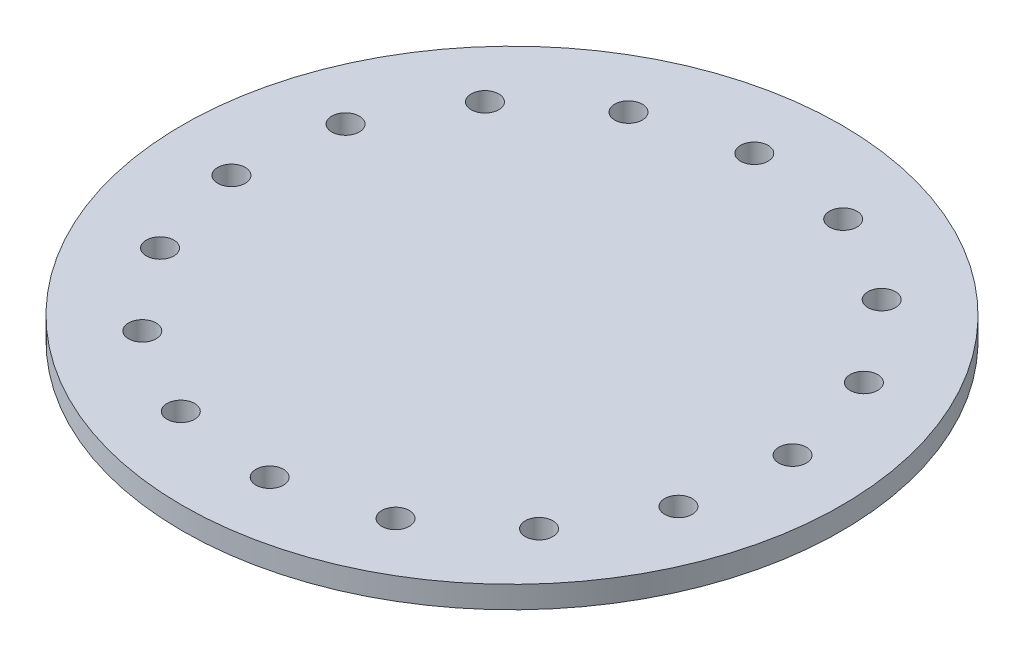
ISO-10303-21;
HEADER;
FILE_DESCRIPTION(('STEP AP214'),'2;1');
FILE_NAME('part.step','',(''),(''),'','','');
FILE_SCHEMA(('AUTOMOTIVE_DESIGN { 1 0 10303 214 1 1 1 1 }'));
ENDSEC;
DATA;
#1=APPLICATION_CONTEXT('core data for automotive mechanical design processes');
#2=APPLICATION_PROTOCOL_DEFINITION('international standard','automotive_design',2000,#1);
#3=PRODUCT_CONTEXT('',#1,'mechanical');
#4=PRODUCT('Part','Part','',(#3));
#5=PRODUCT_RELATED_PRODUCT_CATEGORY('part','',(#4));
#6=PRODUCT_DEFINITION_FORMATION('','',#4);
#7=PRODUCT_DEFINITION_CONTEXT('part definition',#1,'design');
#8=PRODUCT_DEFINITION('design','',#6,#7);
#9=PRODUCT_DEFINITION_SHAPE('','',#8);
#10=(LENGTH_UNIT() NAMED_UNIT(*) SI_UNIT(.MILLI.,.METRE.));
#11=(NAMED_UNIT(*) PLANE_ANGLE_UNIT() SI_UNIT($,.RADIAN.));
#12=(NAMED_UNIT(*) SI_UNIT($,.STERADIAN.) SOLID_ANGLE_UNIT());
#13=UNCERTAINTY_MEASURE_WITH_UNIT(LENGTH_MEASURE(1.E-05),#10,'distance_accuracy_value','');
#14=(GEOMETRIC_REPRESENTATION_CONTEXT(3) GLOBAL_UNCERTAINTY_ASSIGNED_CONTEXT((#13)) GLOBAL_UNIT_ASSIGNED_CONTEXT((#10,
#11,#12)) REPRESENTATION_CONTEXT('',''));
#15=CARTESIAN_POINT('',(0.,0.,0.));
#16=DIRECTION('',(0.,0.,1.));
#17=DIRECTION('',(1.,0.,0.));
#18=AXIS2_PLACEMENT_3D('',#15,#16,#17);
#19=CARTESIAN_POINT('',(0.,1.,0.));
#20=DIRECTION('',(0.,-1.,0.));
#21=DIRECTION('',(0.,0.,-1.));
#22=AXIS2_PLACEMENT_3D('',#19,#20,#21);
#23=CYLINDRICAL_SURFACE('',#22,29.86111111);
#24=CARTESIAN_POINT('',(0.,1.,0.));
#25=DIRECTION('',(0.,1.,0.));
#26=DIRECTION('',(0.,0.,1.));
#27=AXIS2_PLACEMENT_3D('',#24,#25,#26);
#28=CIRCLE('',#27,29.86111111);
#29=CARTESIAN_POINT('',(0.,1.,29.86111111));
#30=VERTEX_POINT('',#29);
#31=EDGE_CURVE('E10',#30,#30,#28,.T.);
#32=ORIENTED_EDGE('',*,*,#31,.F.);
#33=EDGE_LOOP('',(#32));
#34=FACE_BOUND('',#33,.T.);
#35=CARTESIAN_POINT('',(0.,-1.,0.));
#36=DIRECTION('',(0.,1.,0.));
#37=DIRECTION('',(0.,0.,1.));
#38=AXIS2_PLACEMENT_3D('',#35,#36,#37);
#39=CIRCLE('',#38,29.86111111);
#40=CARTESIAN_POINT('',(0.,-1.,29.86111111));
#41=VERTEX_POINT('',#40);
#42=EDGE_CURVE('E40',#41,#41,#39,.T.);
#43=ORIENTED_EDGE('',*,*,#42,.T.);
#44=EDGE_LOOP('',(#43));
#45=FACE_BOUND('',#44,.T.);
#46=ADVANCED_FACE('F37',(#34,#45),#23,.T.);
#47=CARTESIAN_POINT('',(0.,1.,0.));
#48=DIRECTION('',(0.,1.,0.));
#49=DIRECTION('',(0.,0.,1.));
#50=AXIS2_PLACEMENT_3D('',#47,#48,#49);
#51=PLANE('',#50);
#52=CARTESIAN_POINT('',(7.46283868033029,1.,-22.5470294901846));
#53=DIRECTION('',(0.,1.,0.));
#54=DIRECTION('',(0.,0.,1.));
#55=AXIS2_PLACEMENT_3D('',#52,#53,#54);
#56=CIRCLE('',#55,1.25);
#57=CARTESIAN_POINT('',(7.46283868033029,1.,-21.2970294901846));
#58=VERTEX_POINT('',#57);
#59=EDGE_CURVE('E47',#58,#58,#56,.T.);
#60=ORIENTED_EDGE('',*,*,#59,.F.);
#61=EDGE_LOOP('',(#60));
#62=FACE_BOUND('',#61,.T.);
#63=CARTESIAN_POINT('',(15.5231385461332,1.,-17.9748343435354));
#64=DIRECTION('',(0.,1.,0.));
#65=DIRECTION('',(0.,0.,1.));
#66=AXIS2_PLACEMENT_3D('',#63,#64,#65);
#67=CIRCLE('',#66,1.25000000000001);
#68=CARTESIAN_POINT('',(15.5231385461332,1.,-16.7248343435354));
#69=VERTEX_POINT('',#68);
#70=EDGE_CURVE('E51',#69,#69,#67,.T.);
#71=ORIENTED_EDGE('',*,*,#70,.F.);
#72=EDGE_LOOP('',(#71));
#73=FACE_BOUND('',#72,.T.);
#74=CARTESIAN_POINT('',(21.2201812858892,1.,-10.6661336103613));
#75=DIRECTION('',(0.,1.,0.));
#76=DIRECTION('',(0.,0.,1.));
#77=AXIS2_PLACEMENT_3D('',#74,#75,#76);
#78=CIRCLE('',#77,1.25);
#79=CARTESIAN_POINT('',(21.2201812858892,1.,-9.41613361036133));
#80=VERTEX_POINT('',#79);
#81=EDGE_CURVE('E54',#80,#80,#78,.T.);
#82=ORIENTED_EDGE('',*,*,#81,.F.);
#83=EDGE_LOOP('',(#82));
#84=FACE_BOUND('',#83,.T.);
#85=CARTESIAN_POINT('',(23.6866437862914,1.,-1.73361072375152));
#86=DIRECTION('',(0.,1.,0.));
#87=DIRECTION('',(0.,0.,1.));
#88=AXIS2_PLACEMENT_3D('',#85,#86,#87);
#89=CIRCLE('',#88,1.25);
#90=CARTESIAN_POINT('',(23.6866437862914,1.,-0.483610723751521));
#91=VERTEX_POINT('',#90);
#92=EDGE_CURVE('E57',#91,#91,#89,.T.);
#93=ORIENTED_EDGE('',*,*,#92,.F.);
#94=EDGE_LOOP('',(#93));
#95=FACE_BOUND('',#94,.T.);
#96=CARTESIAN_POINT('',(22.5470294901922,1.,7.46283868032999));
#97=DIRECTION('',(0.,1.,0.));
#98=DIRECTION('',(0.,0.,1.));
#99=AXIS2_PLACEMENT_3D('',#96,#97,#98);
#100=CIRCLE('',#99,1.25);
#101=CARTESIAN_POINT('',(22.5470294901922,1.,8.71283868032999));
#102=VERTEX_POINT('',#101);
#103=EDGE_CURVE('E60',#102,#102,#100,.T.);
#104=ORIENTED_EDGE('',*,*,#103,.F.);
#105=EDGE_LOOP('',(#104));
#106=FACE_BOUND('',#105,.T.);
#107=CARTESIAN_POINT('',(17.974834343543,1.,15.5231385461329));
#108=DIRECTION('',(0.,1.,0.));
#109=DIRECTION('',(0.,0.,1.));
#110=AXIS2_PLACEMENT_3D('',#107,#108,#109);
#111=CIRCLE('',#110,1.25);
#112=CARTESIAN_POINT('',(17.974834343543,1.,16.7731385461329));
#113=VERTEX_POINT('',#112);
#114=EDGE_CURVE('E63',#113,#113,#111,.T.);
#115=ORIENTED_EDGE('',*,*,#114,.F.);
#116=EDGE_LOOP('',(#115));
#117=FACE_BOUND('',#116,.T.);
#118=CARTESIAN_POINT('',(10.666133610369,1.,21.220181285889));
#119=DIRECTION('',(0.,1.,0.));
#120=DIRECTION('',(0.,0.,1.));
#121=AXIS2_PLACEMENT_3D('',#118,#119,#120);
#122=CIRCLE('',#121,1.25000000000003);
#123=CARTESIAN_POINT('',(10.666133610369,1.,22.470181285889));
#124=VERTEX_POINT('',#123);
#125=EDGE_CURVE('E66',#124,#124,#122,.T.);
#126=ORIENTED_EDGE('',*,*,#125,.F.);
#127=EDGE_LOOP('',(#126));
#128=FACE_BOUND('',#127,.T.);
#129=CARTESIAN_POINT('',(-1.7336107237512,1.,-23.686643786284));
#130=DIRECTION('',(0.,1.,0.));
#131=DIRECTION('',(0.,0.,1.));
#132=AXIS2_PLACEMENT_3D('',#129,#130,#131);
#133=CIRCLE('',#132,1.24999999999999);
#134=CARTESIAN_POINT('',(-1.7336107237512,1.,-22.436643786284));
#135=VERTEX_POINT('',#134);
#136=EDGE_CURVE('E69',#135,#135,#133,.T.);
#137=ORIENTED_EDGE('',*,*,#136,.F.);
#138=EDGE_LOOP('',(#137));
#139=FACE_BOUND('',#138,.T.);
#140=CARTESIAN_POINT('',(-10.6661336103613,1.,-21.2201812858817));
#141=DIRECTION('',(0.,1.,0.));
#142=DIRECTION('',(0.,0.,1.));
#143=AXIS2_PLACEMENT_3D('',#140,#141,#142);
#144=CIRCLE('',#143,1.25000000000003);
#145=CARTESIAN_POINT('',(-10.6661336103613,1.,-19.9701812858817));
#146=VERTEX_POINT('',#145);
#147=EDGE_CURVE('E72',#146,#146,#144,.T.);
#148=ORIENTED_EDGE('',*,*,#147,.F.);
#149=EDGE_LOOP('',(#148));
#150=FACE_BOUND('',#149,.T.);
#151=CARTESIAN_POINT('',(-17.9748343435354,1.,-15.5231385461257));
#152=DIRECTION('',(0.,1.,0.));
#153=DIRECTION('',(0.,0.,1.));
#154=AXIS2_PLACEMENT_3D('',#151,#152,#153);
#155=CIRCLE('',#154,1.24999999999999);
#156=CARTESIAN_POINT('',(-17.9748343435354,1.,-14.2731385461257));
#157=VERTEX_POINT('',#156);
#158=EDGE_CURVE('E75',#157,#157,#155,.T.);
#159=ORIENTED_EDGE('',*,*,#158,.F.);
#160=EDGE_LOOP('',(#159));
#161=FACE_BOUND('',#160,.T.);
#162=CARTESIAN_POINT('',(-22.5470294901846,1.,-7.46283868032276));
#163=DIRECTION('',(0.,1.,0.));
#164=DIRECTION('',(0.,0.,1.));
#165=AXIS2_PLACEMENT_3D('',#162,#163,#164);
#166=CIRCLE('',#165,1.25);
#167=CARTESIAN_POINT('',(-22.5470294901846,1.,-6.21283868032276));
#168=VERTEX_POINT('',#167);
#169=EDGE_CURVE('E78',#168,#168,#166,.T.);
#170=ORIENTED_EDGE('',*,*,#169,.F.);
#171=EDGE_LOOP('',(#170));
#172=FACE_BOUND('',#171,.T.);
#173=CARTESIAN_POINT('',(-23.6866437862839,1.,1.73361072375891));
#174=DIRECTION('',(0.,1.,0.));
#175=DIRECTION('',(0.,0.,1.));
#176=AXIS2_PLACEMENT_3D('',#173,#174,#175);
#177=CIRCLE('',#176,1.25);
#178=CARTESIAN_POINT('',(-23.6866437862839,1.,2.98361072375891));
#179=VERTEX_POINT('',#178);
#180=EDGE_CURVE('E81',#179,#179,#177,.T.);
#181=ORIENTED_EDGE('',*,*,#180,.F.);
#182=EDGE_LOOP('',(#181));
#183=FACE_BOUND('',#182,.T.);
#184=CARTESIAN_POINT('',(-21.2201812858815,1.,10.6661336103689));
#185=DIRECTION('',(0.,1.,0.));
#186=DIRECTION('',(0.,0.,1.));
#187=AXIS2_PLACEMENT_3D('',#184,#185,#186);
#188=CIRCLE('',#187,1.25);
#189=CARTESIAN_POINT('',(-21.2201812858815,1.,11.9161336103689));
#190=VERTEX_POINT('',#189);
#191=EDGE_CURVE('E84',#190,#190,#188,.T.);
#192=ORIENTED_EDGE('',*,*,#191,.F.);
#193=EDGE_LOOP('',(#192));
#194=FACE_BOUND('',#193,.T.);
#195=CARTESIAN_POINT('',(-15.5231385461255,1.,17.9748343435429));
#196=DIRECTION('',(0.,1.,0.));
#197=DIRECTION('',(0.,0.,1.));
#198=AXIS2_PLACEMENT_3D('',#195,#196,#197);
#199=CIRCLE('',#198,1.25);
#200=CARTESIAN_POINT('',(-15.5231385461255,1.,19.2248343435429));
#201=VERTEX_POINT('',#200);
#202=EDGE_CURVE('E87',#201,#201,#199,.T.);
#203=ORIENTED_EDGE('',*,*,#202,.F.);
#204=EDGE_LOOP('',(#203));
#205=FACE_BOUND('',#204,.T.);
#206=CARTESIAN_POINT('',(-7.46283868032261,1.,22.5470294901921));
#207=DIRECTION('',(0.,1.,0.));
#208=DIRECTION('',(0.,0.,1.));
#209=AXIS2_PLACEMENT_3D('',#206,#207,#208);
#210=CIRCLE('',#209,1.24999999999998);
#211=CARTESIAN_POINT('',(-7.46283868032261,1.,23.7970294901921));
#212=VERTEX_POINT('',#211);
#213=EDGE_CURVE('E90',#212,#212,#210,.T.);
#214=ORIENTED_EDGE('',*,*,#213,.F.);
#215=EDGE_LOOP('',(#214));
#216=FACE_BOUND('',#215,.T.);
#217=CARTESIAN_POINT('',(1.73361072375891,1.,23.6866437862914));
#218=DIRECTION('',(0.,1.,0.));
#219=DIRECTION('',(0.,0.,1.));
#220=AXIS2_PLACEMENT_3D('',#217,#218,#219);
#221=CIRCLE('',#220,1.25);
#222=CARTESIAN_POINT('',(1.73361072375891,1.,24.9366437862914));
#223=VERTEX_POINT('',#222);
#224=EDGE_CURVE('E93',#223,#223,#221,.T.);
#225=ORIENTED_EDGE('',*,*,#224,.F.);
#226=EDGE_LOOP('',(#225));
#227=FACE_BOUND('',#226,.T.);
#228=ORIENTED_EDGE('',*,*,#31,.T.);
#229=EDGE_LOOP('',(#228));
#230=FACE_BOUND('',#229,.T.);
#231=ADVANCED_FACE('F164',(#62,#73,#84,#95,#106,#117,#128,#139,#150,#161,#172,#183,#194,#205,
#216,#227,#230),#51,.T.);
#232=CARTESIAN_POINT('',(0.,-1.,0.));
#233=DIRECTION('',(0.,1.,0.));
#234=DIRECTION('',(0.,0.,1.));
#235=AXIS2_PLACEMENT_3D('',#232,#233,#234);
#236=PLANE('',#235);
#237=CARTESIAN_POINT('',(7.46283868033029,-1.,-22.5470294901846));
#238=DIRECTION('',(0.,1.,0.));
#239=DIRECTION('',(0.,0.,1.));
#240=AXIS2_PLACEMENT_3D('',#237,#238,#239);
#241=CIRCLE('',#240,1.25);
#242=CARTESIAN_POINT('',(7.46283868033029,-1.,-21.2970294901846));
#243=VERTEX_POINT('',#242);
#244=EDGE_CURVE('E100',#243,#243,#241,.T.);
#245=ORIENTED_EDGE('',*,*,#244,.T.);
#246=EDGE_LOOP('',(#245));
#247=FACE_BOUND('',#246,.T.);
#248=CARTESIAN_POINT('',(15.5231385461332,-1.,-17.9748343435354));
#249=DIRECTION('',(0.,1.,0.));
#250=DIRECTION('',(0.,0.,1.));
#251=AXIS2_PLACEMENT_3D('',#248,#249,#250);
#252=CIRCLE('',#251,1.25000000000001);
#253=CARTESIAN_POINT('',(15.5231385461332,-1.,-16.7248343435354));
#254=VERTEX_POINT('',#253);
#255=EDGE_CURVE('E103',#254,#254,#252,.T.);
#256=ORIENTED_EDGE('',*,*,#255,.T.);
#257=EDGE_LOOP('',(#256));
#258=FACE_BOUND('',#257,.T.);
#259=CARTESIAN_POINT('',(21.2201812858892,-1.,-10.6661336103613));
#260=DIRECTION('',(0.,1.,0.));
#261=DIRECTION('',(0.,0.,1.));
#262=AXIS2_PLACEMENT_3D('',#259,#260,#261);
#263=CIRCLE('',#262,1.25);
#264=CARTESIAN_POINT('',(21.2201812858892,-1.,-9.41613361036133));
#265=VERTEX_POINT('',#264);
#266=EDGE_CURVE('E106',#265,#265,#263,.T.);
#267=ORIENTED_EDGE('',*,*,#266,.T.);
#268=EDGE_LOOP('',(#267));
#269=FACE_BOUND('',#268,.T.);
#270=CARTESIAN_POINT('',(23.6866437862914,-1.,-1.73361072375152));
#271=DIRECTION('',(0.,1.,0.));
#272=DIRECTION('',(0.,0.,1.));
#273=AXIS2_PLACEMENT_3D('',#270,#271,#272);
#274=CIRCLE('',#273,1.25);
#275=CARTESIAN_POINT('',(23.6866437862914,-1.,-0.483610723751521));
#276=VERTEX_POINT('',#275);
#277=EDGE_CURVE('E109',#276,#276,#274,.T.);
#278=ORIENTED_EDGE('',*,*,#277,.T.);
#279=EDGE_LOOP('',(#278));
#280=FACE_BOUND('',#279,.T.);
#281=CARTESIAN_POINT('',(22.5470294901922,-1.,7.46283868032999));
#282=DIRECTION('',(0.,1.,0.));
#283=DIRECTION('',(0.,0.,1.));
#284=AXIS2_PLACEMENT_3D('',#281,#282,#283);
#285=CIRCLE('',#284,1.25);
#286=CARTESIAN_POINT('',(22.5470294901922,-1.,8.71283868032999));
#287=VERTEX_POINT('',#286);
#288=EDGE_CURVE('E112',#287,#287,#285,.T.);
#289=ORIENTED_EDGE('',*,*,#288,.T.);
#290=EDGE_LOOP('',(#289));
#291=FACE_BOUND('',#290,.T.);
#292=CARTESIAN_POINT('',(17.974834343543,-1.,15.5231385461329));
#293=DIRECTION('',(0.,1.,0.));
#294=DIRECTION('',(0.,0.,1.));
#295=AXIS2_PLACEMENT_3D('',#292,#293,#294);
#296=CIRCLE('',#295,1.25);
#297=CARTESIAN_POINT('',(17.974834343543,-1.,16.7731385461329));
#298=VERTEX_POINT('',#297);
#299=EDGE_CURVE('E115',#298,#298,#296,.T.);
#300=ORIENTED_EDGE('',*,*,#299,.T.);
#301=EDGE_LOOP('',(#300));
#302=FACE_BOUND('',#301,.T.);
#303=CARTESIAN_POINT('',(10.666133610369,-1.,21.220181285889));
#304=DIRECTION('',(0.,1.,0.));
#305=DIRECTION('',(0.,0.,1.));
#306=AXIS2_PLACEMENT_3D('',#303,#304,#305);
#307=CIRCLE('',#306,1.25000000000003);
#308=CARTESIAN_POINT('',(10.666133610369,-1.,22.470181285889));
#309=VERTEX_POINT('',#308);
#310=EDGE_CURVE('E118',#309,#309,#307,.T.);
#311=ORIENTED_EDGE('',*,*,#310,.T.);
#312=EDGE_LOOP('',(#311));
#313=FACE_BOUND('',#312,.T.);
#314=CARTESIAN_POINT('',(-1.7336107237512,-1.,-23.686643786284));
#315=DIRECTION('',(0.,1.,0.));
#316=DIRECTION('',(0.,0.,1.));
#317=AXIS2_PLACEMENT_3D('',#314,#315,#316);
#318=CIRCLE('',#317,1.24999999999999);
#319=CARTESIAN_POINT('',(-1.7336107237512,-1.,-22.436643786284));
#320=VERTEX_POINT('',#319);
#321=EDGE_CURVE('E121',#320,#320,#318,.T.);
#322=ORIENTED_EDGE('',*,*,#321,.T.);
#323=EDGE_LOOP('',(#322));
#324=FACE_BOUND('',#323,.T.);
#325=CARTESIAN_POINT('',(-10.6661336103613,-1.,-21.2201812858817));
#326=DIRECTION('',(0.,1.,0.));
#327=DIRECTION('',(0.,0.,1.));
#328=AXIS2_PLACEMENT_3D('',#325,#326,#327);
#329=CIRCLE('',#328,1.25000000000003);
#330=CARTESIAN_POINT('',(-10.6661336103613,-1.,-19.9701812858817));
#331=VERTEX_POINT('',#330);
#332=EDGE_CURVE('E124',#331,#331,#329,.T.);
#333=ORIENTED_EDGE('',*,*,#332,.T.);
#334=EDGE_LOOP('',(#333));
#335=FACE_BOUND('',#334,.T.);
#336=CARTESIAN_POINT('',(-17.9748343435354,-1.,-15.5231385461257));
#337=DIRECTION('',(0.,1.,0.));
#338=DIRECTION('',(0.,0.,1.));
#339=AXIS2_PLACEMENT_3D('',#336,#337,#338);
#340=CIRCLE('',#339,1.24999999999999);
#341=CARTESIAN_POINT('',(-17.9748343435354,-1.,-14.2731385461257));
#342=VERTEX_POINT('',#341);
#343=EDGE_CURVE('E127',#342,#342,#340,.T.);
#344=ORIENTED_EDGE('',*,*,#343,.T.);
#345=EDGE_LOOP('',(#344));
#346=FACE_BOUND('',#345,.T.);
#347=CARTESIAN_POINT('',(-22.5470294901846,-1.,-7.46283868032276));
#348=DIRECTION('',(0.,1.,0.));
#349=DIRECTION('',(0.,0.,1.));
#350=AXIS2_PLACEMENT_3D('',#347,#348,#349);
#351=CIRCLE('',#350,1.25);
#352=CARTESIAN_POINT('',(-22.5470294901846,-1.,-6.21283868032276));
#353=VERTEX_POINT('',#352);
#354=EDGE_CURVE('E130',#353,#353,#351,.T.);
#355=ORIENTED_EDGE('',*,*,#354,.T.);
#356=EDGE_LOOP('',(#355));
#357=FACE_BOUND('',#356,.T.);
#358=CARTESIAN_POINT('',(-23.6866437862839,-1.,1.73361072375891));
#359=DIRECTION('',(0.,1.,0.));
#360=DIRECTION('',(0.,0.,1.));
#361=AXIS2_PLACEMENT_3D('',#358,#359,#360);
#362=CIRCLE('',#361,1.25);
#363=CARTESIAN_POINT('',(-23.6866437862839,-1.,2.98361072375891));
#364=VERTEX_POINT('',#363);
#365=EDGE_CURVE('E133',#364,#364,#362,.T.);
#366=ORIENTED_EDGE('',*,*,#365,.T.);
#367=EDGE_LOOP('',(#366));
#368=FACE_BOUND('',#367,.T.);
#369=CARTESIAN_POINT('',(-21.2201812858815,-1.,10.6661336103689));
#370=DIRECTION('',(0.,1.,0.));
#371=DIRECTION('',(0.,0.,1.));
#372=AXIS2_PLACEMENT_3D('',#369,#370,#371);
#373=CIRCLE('',#372,1.25);
#374=CARTESIAN_POINT('',(-21.2201812858815,-1.,11.9161336103689));
#375=VERTEX_POINT('',#374);
#376=EDGE_CURVE('E136',#375,#375,#373,.T.);
#377=ORIENTED_EDGE('',*,*,#376,.T.);
#378=EDGE_LOOP('',(#377));
#379=FACE_BOUND('',#378,.T.);
#380=CARTESIAN_POINT('',(-15.5231385461255,-1.,17.9748343435429));
#381=DIRECTION('',(0.,1.,0.));
#382=DIRECTION('',(0.,0.,1.));
#383=AXIS2_PLACEMENT_3D('',#380,#381,#382);
#384=CIRCLE('',#383,1.25);
#385=CARTESIAN_POINT('',(-15.5231385461255,-1.,19.2248343435429));
#386=VERTEX_POINT('',#385);
#387=EDGE_CURVE('E139',#386,#386,#384,.T.);
#388=ORIENTED_EDGE('',*,*,#387,.T.);
#389=EDGE_LOOP('',(#388));
#390=FACE_BOUND('',#389,.T.);
#391=CARTESIAN_POINT('',(-7.46283868032261,-1.,22.5470294901921));
#392=DIRECTION('',(0.,1.,0.));
#393=DIRECTION('',(0.,0.,1.));
#394=AXIS2_PLACEMENT_3D('',#391,#392,#393);
#395=CIRCLE('',#394,1.24999999999998);
#396=CARTESIAN_POINT('',(-7.46283868032261,-1.,23.7970294901921));
#397=VERTEX_POINT('',#396);
#398=EDGE_CURVE('E99',#397,#397,#395,.T.);
#399=ORIENTED_EDGE('',*,*,#398,.T.);
#400=EDGE_LOOP('',(#399));
#401=FACE_BOUND('',#400,.T.);
#402=CARTESIAN_POINT('',(1.73361072375891,-1.,23.6866437862914));
#403=DIRECTION('',(0.,1.,0.));
#404=DIRECTION('',(0.,0.,1.));
#405=AXIS2_PLACEMENT_3D('',#402,#403,#404);
#406=CIRCLE('',#405,1.25);
#407=CARTESIAN_POINT('',(1.73361072375891,-1.,24.9366437862914));
#408=VERTEX_POINT('',#407);
#409=EDGE_CURVE('E96',#408,#408,#406,.T.);
#410=ORIENTED_EDGE('',*,*,#409,.T.);
#411=EDGE_LOOP('',(#410));
#412=FACE_BOUND('',#411,.T.);
#413=ORIENTED_EDGE('',*,*,#42,.F.);
#414=EDGE_LOOP('',(#413));
#415=FACE_BOUND('',#414,.T.);
#416=ADVANCED_FACE('F145',(#247,#258,#269,#280,#291,#302,#313,#324,#335,#346,#357,#368,#379,
#390,#401,#412,#415),#236,.F.);
#417=CARTESIAN_POINT('',(1.73361072375891,-1.,23.6866437862914));
#418=DIRECTION('',(0.,1.,0.));
#419=DIRECTION('',(0.,0.,1.));
#420=AXIS2_PLACEMENT_3D('',#417,#418,#419);
#421=CYLINDRICAL_SURFACE('',#420,1.25);
#422=ORIENTED_EDGE('',*,*,#224,.T.);
#423=EDGE_LOOP('',(#422));
#424=FACE_BOUND('',#423,.T.);
#425=ORIENTED_EDGE('',*,*,#409,.F.);
#426=EDGE_LOOP('',(#425));
#427=FACE_BOUND('',#426,.T.);
#428=ADVANCED_FACE('F151',(#424,#427),#421,.F.);
#429=CARTESIAN_POINT('',(-7.46283868032261,-1.,22.5470294901921));
#430=DIRECTION('',(0.,1.,0.));
#431=DIRECTION('',(0.,0.,1.));
#432=AXIS2_PLACEMENT_3D('',#429,#430,#431);
#433=CYLINDRICAL_SURFACE('',#432,1.24999999999998);
#434=ORIENTED_EDGE('',*,*,#213,.T.);
#435=EDGE_LOOP('',(#434));
#436=FACE_BOUND('',#435,.T.);
#437=ORIENTED_EDGE('',*,*,#398,.F.);
#438=EDGE_LOOP('',(#437));
#439=FACE_BOUND('',#438,.T.);
#440=ADVANCED_FACE('F148',(#436,#439),#433,.F.);
#441=CARTESIAN_POINT('',(-15.5231385461255,-1.,17.9748343435429));
#442=DIRECTION('',(0.,1.,0.));
#443=DIRECTION('',(0.,0.,1.));
#444=AXIS2_PLACEMENT_3D('',#441,#442,#443);
#445=CYLINDRICAL_SURFACE('',#444,1.25);
#446=ORIENTED_EDGE('',*,*,#202,.T.);
#447=EDGE_LOOP('',(#446));
#448=FACE_BOUND('',#447,.T.);
#449=ORIENTED_EDGE('',*,*,#387,.F.);
#450=EDGE_LOOP('',(#449));
#451=FACE_BOUND('',#450,.T.);
#452=ADVANCED_FACE('F150',(#448,#451),#445,.F.);
#453=CARTESIAN_POINT('',(-21.2201812858815,-1.,10.6661336103689));
#454=DIRECTION('',(0.,1.,0.));
#455=DIRECTION('',(0.,0.,1.));
#456=AXIS2_PLACEMENT_3D('',#453,#454,#455);
#457=CYLINDRICAL_SURFACE('',#456,1.25);
#458=ORIENTED_EDGE('',*,*,#191,.T.);
#459=EDGE_LOOP('',(#458));
#460=FACE_BOUND('',#459,.T.);
#461=ORIENTED_EDGE('',*,*,#376,.F.);
#462=EDGE_LOOP('',(#461));
#463=FACE_BOUND('',#462,.T.);
#464=ADVANCED_FACE('F158',(#460,#463),#457,.F.);
#465=CARTESIAN_POINT('',(-23.6866437862839,-1.,1.73361072375891));
#466=DIRECTION('',(0.,1.,0.));
#467=DIRECTION('',(0.,0.,1.));
#468=AXIS2_PLACEMENT_3D('',#465,#466,#467);
#469=CYLINDRICAL_SURFACE('',#468,1.25);
#470=ORIENTED_EDGE('',*,*,#180,.T.);
#471=EDGE_LOOP('',(#470));
#472=FACE_BOUND('',#471,.T.);
#473=ORIENTED_EDGE('',*,*,#365,.F.);
#474=EDGE_LOOP('',(#473));
#475=FACE_BOUND('',#474,.T.);
#476=ADVANCED_FACE('F223',(#472,#475),#469,.F.);
#477=CARTESIAN_POINT('',(-22.5470294901846,-1.,-7.46283868032276));
#478=DIRECTION('',(0.,1.,0.));
#479=DIRECTION('',(0.,0.,1.));
#480=AXIS2_PLACEMENT_3D('',#477,#478,#479);
#481=CYLINDRICAL_SURFACE('',#480,1.25);
#482=ORIENTED_EDGE('',*,*,#169,.T.);
#483=EDGE_LOOP('',(#482));
#484=FACE_BOUND('',#483,.T.);
#485=ORIENTED_EDGE('',*,*,#354,.F.);
#486=EDGE_LOOP('',(#485));
#487=FACE_BOUND('',#486,.T.);
#488=ADVANCED_FACE('F219',(#484,#487),#481,.F.);
#489=CARTESIAN_POINT('',(-17.9748343435354,-1.,-15.5231385461257));
#490=DIRECTION('',(0.,1.,0.));
#491=DIRECTION('',(0.,0.,1.));
#492=AXIS2_PLACEMENT_3D('',#489,#490,#491);
#493=CYLINDRICAL_SURFACE('',#492,1.24999999999999);
#494=ORIENTED_EDGE('',*,*,#158,.T.);
#495=EDGE_LOOP('',(#494));
#496=FACE_BOUND('',#495,.T.);
#497=ORIENTED_EDGE('',*,*,#343,.F.);
#498=EDGE_LOOP('',(#497));
#499=FACE_BOUND('',#498,.T.);
#500=ADVANCED_FACE('F215',(#496,#499),#493,.F.);
#501=CARTESIAN_POINT('',(-10.6661336103613,-1.,-21.2201812858817));
#502=DIRECTION('',(0.,1.,0.));
#503=DIRECTION('',(0.,0.,1.));
#504=AXIS2_PLACEMENT_3D('',#501,#502,#503);
#505=CYLINDRICAL_SURFACE('',#504,1.25000000000003);
#506=ORIENTED_EDGE('',*,*,#147,.T.);
#507=EDGE_LOOP('',(#506));
#508=FACE_BOUND('',#507,.T.);
#509=ORIENTED_EDGE('',*,*,#332,.F.);
#510=EDGE_LOOP('',(#509));
#511=FACE_BOUND('',#510,.T.);
#512=ADVANCED_FACE('F211',(#508,#511),#505,.F.);
#513=CARTESIAN_POINT('',(-1.7336107237512,-1.,-23.686643786284));
#514=DIRECTION('',(0.,1.,0.));
#515=DIRECTION('',(0.,0.,1.));
#516=AXIS2_PLACEMENT_3D('',#513,#514,#515);
#517=CYLINDRICAL_SURFACE('',#516,1.24999999999999);
#518=ORIENTED_EDGE('',*,*,#136,.T.);
#519=EDGE_LOOP('',(#518));
#520=FACE_BOUND('',#519,.T.);
#521=ORIENTED_EDGE('',*,*,#321,.F.);
#522=EDGE_LOOP('',(#521));
#523=FACE_BOUND('',#522,.T.);
#524=ADVANCED_FACE('F207',(#520,#523),#517,.F.);
#525=CARTESIAN_POINT('',(10.666133610369,-1.,21.220181285889));
#526=DIRECTION('',(0.,1.,0.));
#527=DIRECTION('',(0.,0.,1.));
#528=AXIS2_PLACEMENT_3D('',#525,#526,#527);
#529=CYLINDRICAL_SURFACE('',#528,1.25000000000003);
#530=ORIENTED_EDGE('',*,*,#125,.T.);
#531=EDGE_LOOP('',(#530));
#532=FACE_BOUND('',#531,.T.);
#533=ORIENTED_EDGE('',*,*,#310,.F.);
#534=EDGE_LOOP('',(#533));
#535=FACE_BOUND('',#534,.T.);
#536=ADVANCED_FACE('F203',(#532,#535),#529,.F.);
#537=CARTESIAN_POINT('',(17.974834343543,-1.,15.5231385461329));
#538=DIRECTION('',(0.,1.,0.));
#539=DIRECTION('',(0.,0.,1.));
#540=AXIS2_PLACEMENT_3D('',#537,#538,#539);
#541=CYLINDRICAL_SURFACE('',#540,1.25);
#542=ORIENTED_EDGE('',*,*,#114,.T.);
#543=EDGE_LOOP('',(#542));
#544=FACE_BOUND('',#543,.T.);
#545=ORIENTED_EDGE('',*,*,#299,.F.);
#546=EDGE_LOOP('',(#545));
#547=FACE_BOUND('',#546,.T.);
#548=ADVANCED_FACE('F199',(#544,#547),#541,.F.);
#549=CARTESIAN_POINT('',(22.5470294901922,-1.,7.46283868032999));
#550=DIRECTION('',(0.,1.,0.));
#551=DIRECTION('',(0.,0.,1.));
#552=AXIS2_PLACEMENT_3D('',#549,#550,#551);
#553=CYLINDRICAL_SURFACE('',#552,1.25);
#554=ORIENTED_EDGE('',*,*,#103,.T.);
#555=EDGE_LOOP('',(#554));
#556=FACE_BOUND('',#555,.T.);
#557=ORIENTED_EDGE('',*,*,#288,.F.);
#558=EDGE_LOOP('',(#557));
#559=FACE_BOUND('',#558,.T.);
#560=ADVANCED_FACE('F195',(#556,#559),#553,.F.);
#561=CARTESIAN_POINT('',(23.6866437862914,-1.,-1.73361072375152));
#562=DIRECTION('',(0.,1.,0.));
#563=DIRECTION('',(0.,0.,1.));
#564=AXIS2_PLACEMENT_3D('',#561,#562,#563);
#565=CYLINDRICAL_SURFACE('',#564,1.25);
#566=ORIENTED_EDGE('',*,*,#92,.T.);
#567=EDGE_LOOP('',(#566));
#568=FACE_BOUND('',#567,.T.);
#569=ORIENTED_EDGE('',*,*,#277,.F.);
#570=EDGE_LOOP('',(#569));
#571=FACE_BOUND('',#570,.T.);
#572=ADVANCED_FACE('F191',(#568,#571),#565,.F.);
#573=CARTESIAN_POINT('',(21.2201812858892,-1.,-10.6661336103613));
#574=DIRECTION('',(0.,1.,0.));
#575=DIRECTION('',(0.,0.,1.));
#576=AXIS2_PLACEMENT_3D('',#573,#574,#575);
#577=CYLINDRICAL_SURFACE('',#576,1.25);
#578=ORIENTED_EDGE('',*,*,#81,.T.);
#579=EDGE_LOOP('',(#578));
#580=FACE_BOUND('',#579,.T.);
#581=ORIENTED_EDGE('',*,*,#266,.F.);
#582=EDGE_LOOP('',(#581));
#583=FACE_BOUND('',#582,.T.);
#584=ADVANCED_FACE('F187',(#580,#583),#577,.F.);
#585=CARTESIAN_POINT('',(15.5231385461332,-1.,-17.9748343435354));
#586=DIRECTION('',(0.,1.,0.));
#587=DIRECTION('',(0.,0.,1.));
#588=AXIS2_PLACEMENT_3D('',#585,#586,#587);
#589=CYLINDRICAL_SURFACE('',#588,1.25000000000001);
#590=ORIENTED_EDGE('',*,*,#70,.T.);
#591=EDGE_LOOP('',(#590));
#592=FACE_BOUND('',#591,.T.);
#593=ORIENTED_EDGE('',*,*,#255,.F.);
#594=EDGE_LOOP('',(#593));
#595=FACE_BOUND('',#594,.T.);
#596=ADVANCED_FACE('F183',(#592,#595),#589,.F.);
#597=CARTESIAN_POINT('',(7.46283868033029,-1.,-22.5470294901846));
#598=DIRECTION('',(0.,1.,0.));
#599=DIRECTION('',(0.,0.,1.));
#600=AXIS2_PLACEMENT_3D('',#597,#598,#599);
#601=CYLINDRICAL_SURFACE('',#600,1.25);
#602=ORIENTED_EDGE('',*,*,#59,.T.);
#603=EDGE_LOOP('',(#602));
#604=FACE_BOUND('',#603,.T.);
#605=ORIENTED_EDGE('',*,*,#244,.F.);
#606=EDGE_LOOP('',(#605));
#607=FACE_BOUND('',#606,.T.);
#608=ADVANCED_FACE('F180',(#604,#607),#601,.F.);
#609=CLOSED_SHELL('',(#46,#231,#416,#428,#440,#452,#464,#476,#488,#500,#512,#524,#536,#548,#560,
#572,#584,#596,#608));
#610=MANIFOLD_SOLID_BREP('B2',#609);
#611=ADVANCED_BREP_SHAPE_REPRESENTATION('',(#18,#610),#14);
#612=SHAPE_DEFINITION_REPRESENTATION(#9,#611);
ENDSEC;
END-ISO-10303-21;
